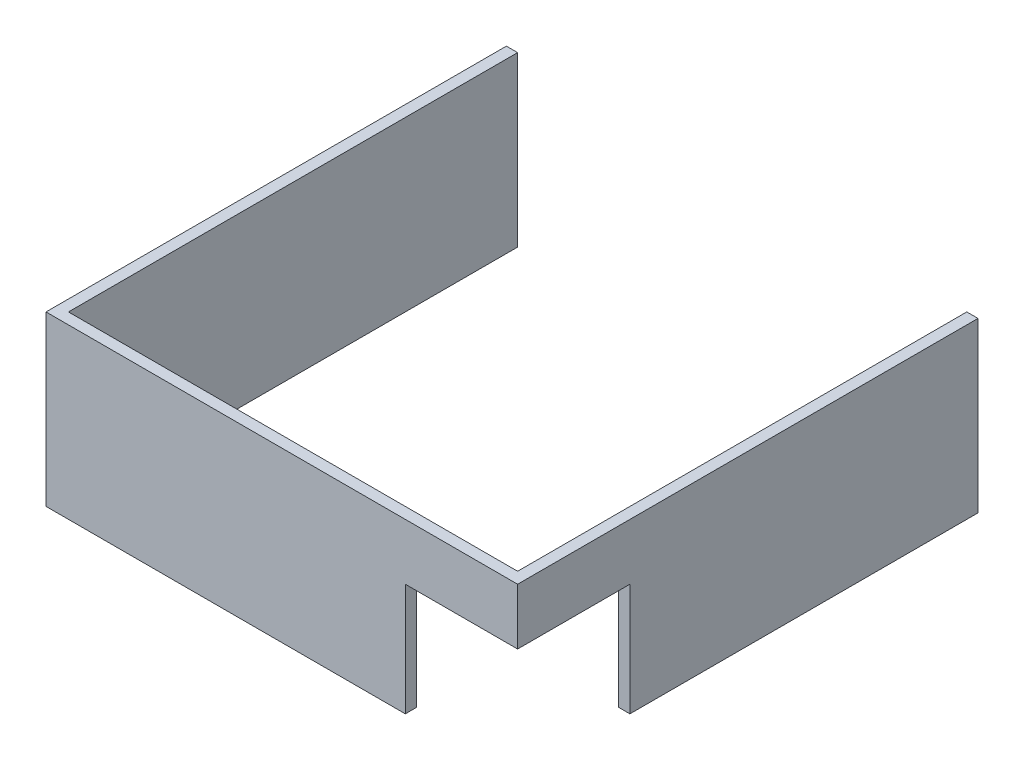
ISO-10303-21;
HEADER;
FILE_DESCRIPTION(('STEP AP214'),'2;1');
FILE_NAME('part.step','',(''),(''),'','','');
FILE_SCHEMA(('AUTOMOTIVE_DESIGN { 1 0 10303 214 1 1 1 1 }'));
ENDSEC;
DATA;
#1=APPLICATION_CONTEXT('core data for automotive mechanical design processes');
#2=APPLICATION_PROTOCOL_DEFINITION('international standard','automotive_design',2000,#1);
#3=PRODUCT_CONTEXT('',#1,'mechanical');
#4=PRODUCT('Part','Part','',(#3));
#5=PRODUCT_RELATED_PRODUCT_CATEGORY('part','',(#4));
#6=PRODUCT_DEFINITION_FORMATION('','',#4);
#7=PRODUCT_DEFINITION_CONTEXT('part definition',#1,'design');
#8=PRODUCT_DEFINITION('design','',#6,#7);
#9=PRODUCT_DEFINITION_SHAPE('','',#8);
#10=(LENGTH_UNIT() NAMED_UNIT(*) SI_UNIT(.MILLI.,.METRE.));
#11=(NAMED_UNIT(*) PLANE_ANGLE_UNIT() SI_UNIT($,.RADIAN.));
#12=(NAMED_UNIT(*) SI_UNIT($,.STERADIAN.) SOLID_ANGLE_UNIT());
#13=UNCERTAINTY_MEASURE_WITH_UNIT(LENGTH_MEASURE(1.E-05),#10,'distance_accuracy_value','');
#14=(GEOMETRIC_REPRESENTATION_CONTEXT(3) GLOBAL_UNCERTAINTY_ASSIGNED_CONTEXT((#13)) GLOBAL_UNIT_ASSIGNED_CONTEXT((#10,
#11,#12)) REPRESENTATION_CONTEXT('',''));
#15=CARTESIAN_POINT('',(0.,0.,0.));
#16=DIRECTION('',(0.,0.,1.));
#17=DIRECTION('',(1.,0.,0.));
#18=AXIS2_PLACEMENT_3D('',#15,#16,#17);
#19=CARTESIAN_POINT('',(0.,0.,0.));
#20=DIRECTION('',(0.,1.,0.));
#21=DIRECTION('',(0.,0.,1.));
#22=AXIS2_PLACEMENT_3D('',#19,#20,#21);
#23=PLANE('',#22);
#24=DIRECTION('',(0.,0.,-1.));
#25=VECTOR('',#24,1.);
#26=CARTESIAN_POINT('',(82.,0.,1.99999999999999));
#27=LINE('',#26,#25);
#28=CARTESIAN_POINT('',(82.,0.,-18.));
#29=VERTEX_POINT('',#28);
#30=CARTESIAN_POINT('',(82.,0.,-80.));
#31=VERTEX_POINT('',#30);
#32=EDGE_CURVE('E152',#29,#31,#27,.T.);
#33=ORIENTED_EDGE('',*,*,#32,.F.);
#34=DIRECTION('',(-1.,0.,0.));
#35=VECTOR('',#34,1.);
#36=CARTESIAN_POINT('',(0.,0.,-18.));
#37=LINE('',#36,#35);
#38=CARTESIAN_POINT('',(80.,0.,-18.));
#39=VERTEX_POINT('',#38);
#40=EDGE_CURVE('E41',#29,#39,#37,.T.);
#41=ORIENTED_EDGE('',*,*,#40,.T.);
#42=DIRECTION('',(0.,0.,1.));
#43=VECTOR('',#42,1.);
#44=CARTESIAN_POINT('',(80.,0.,0.));
#45=LINE('',#44,#43);
#46=CARTESIAN_POINT('',(80.,0.,-80.));
#47=VERTEX_POINT('',#46);
#48=EDGE_CURVE('E155',#47,#39,#45,.T.);
#49=ORIENTED_EDGE('',*,*,#48,.F.);
#50=DIRECTION('',(-1.,0.,0.));
#51=VECTOR('',#50,1.);
#52=CARTESIAN_POINT('',(82.,0.,-80.));
#53=LINE('',#52,#51);
#54=EDGE_CURVE('E124',#31,#47,#53,.T.);
#55=ORIENTED_EDGE('',*,*,#54,.F.);
#56=EDGE_LOOP('',(#33,#41,#49,#55));
#57=FACE_BOUND('',#56,.T.);
#58=ADVANCED_FACE('F33',(#57),#23,.F.);
#59=CARTESIAN_POINT('',(0.,30.,0.));
#60=DIRECTION('',(-1.,0.,0.));
#61=DIRECTION('',(0.,0.,1.));
#62=AXIS2_PLACEMENT_3D('',#59,#60,#61);
#63=PLANE('',#62);
#64=DIRECTION('',(0.,0.,-1.));
#65=VECTOR('',#64,1.);
#66=CARTESIAN_POINT('',(0.,0.,0.));
#67=LINE('',#66,#65);
#68=CARTESIAN_POINT('',(0.,0.,0.));
#69=VERTEX_POINT('',#68);
#70=CARTESIAN_POINT('',(0.,0.,-80.));
#71=VERTEX_POINT('',#70);
#72=EDGE_CURVE('E140',#69,#71,#67,.T.);
#73=ORIENTED_EDGE('',*,*,#72,.T.);
#74=DIRECTION('',(0.,-1.,0.));
#75=VECTOR('',#74,1.);
#76=CARTESIAN_POINT('',(0.,30.,-80.));
#77=LINE('',#76,#75);
#78=CARTESIAN_POINT('',(0.,30.,-80.));
#79=VERTEX_POINT('',#78);
#80=EDGE_CURVE('E171',#79,#71,#77,.T.);
#81=ORIENTED_EDGE('',*,*,#80,.F.);
#82=DIRECTION('',(0.,0.,-1.));
#83=VECTOR('',#82,1.);
#84=CARTESIAN_POINT('',(0.,30.,0.));
#85=LINE('',#84,#83);
#86=CARTESIAN_POINT('',(0.,30.,0.));
#87=VERTEX_POINT('',#86);
#88=EDGE_CURVE('E158',#87,#79,#85,.T.);
#89=ORIENTED_EDGE('',*,*,#88,.F.);
#90=DIRECTION('',(0.,-1.,0.));
#91=VECTOR('',#90,1.);
#92=CARTESIAN_POINT('',(0.,30.,0.));
#93=LINE('',#92,#91);
#94=EDGE_CURVE('E136',#87,#69,#93,.T.);
#95=ORIENTED_EDGE('',*,*,#94,.T.);
#96=EDGE_LOOP('',(#73,#81,#89,#95));
#97=FACE_BOUND('',#96,.T.);
#98=ADVANCED_FACE('F35',(#97),#63,.F.);
#99=CARTESIAN_POINT('',(0.,30.,-80.));
#100=DIRECTION('',(0.,0.,1.));
#101=DIRECTION('',(1.,0.,0.));
#102=AXIS2_PLACEMENT_3D('',#99,#100,#101);
#103=PLANE('',#102);
#104=DIRECTION('',(-1.,0.,0.));
#105=VECTOR('',#104,1.);
#106=CARTESIAN_POINT('',(0.,0.,-80.));
#107=LINE('',#106,#105);
#108=CARTESIAN_POINT('',(-2.,0.,-80.));
#109=VERTEX_POINT('',#108);
#110=EDGE_CURVE('E143',#71,#109,#107,.T.);
#111=ORIENTED_EDGE('',*,*,#110,.T.);
#112=DIRECTION('',(0.,-1.,0.));
#113=VECTOR('',#112,1.);
#114=CARTESIAN_POINT('',(-2.,30.,-80.));
#115=LINE('',#114,#113);
#116=CARTESIAN_POINT('',(-2.,30.,-80.));
#117=VERTEX_POINT('',#116);
#118=EDGE_CURVE('E168',#117,#109,#115,.T.);
#119=ORIENTED_EDGE('',*,*,#118,.F.);
#120=DIRECTION('',(-1.,0.,0.));
#121=VECTOR('',#120,1.);
#122=CARTESIAN_POINT('',(0.,30.,-80.));
#123=LINE('',#122,#121);
#124=EDGE_CURVE('E93',#79,#117,#123,.T.);
#125=ORIENTED_EDGE('',*,*,#124,.F.);
#126=ORIENTED_EDGE('',*,*,#80,.T.);
#127=EDGE_LOOP('',(#111,#119,#125,#126));
#128=FACE_BOUND('',#127,.T.);
#129=ADVANCED_FACE('F250',(#128),#103,.F.);
#130=CARTESIAN_POINT('',(-2.,30.,-80.));
#131=DIRECTION('',(1.,0.,0.));
#132=DIRECTION('',(0.,0.,-1.));
#133=AXIS2_PLACEMENT_3D('',#130,#131,#132);
#134=PLANE('',#133);
#135=DIRECTION('',(0.,0.,1.));
#136=VECTOR('',#135,1.);
#137=CARTESIAN_POINT('',(-2.,0.,-80.));
#138=LINE('',#137,#136);
#139=CARTESIAN_POINT('',(-2.,0.,2.));
#140=VERTEX_POINT('',#139);
#141=EDGE_CURVE('E146',#109,#140,#138,.T.);
#142=ORIENTED_EDGE('',*,*,#141,.T.);
#143=DIRECTION('',(0.,-1.,0.));
#144=VECTOR('',#143,1.);
#145=CARTESIAN_POINT('',(-2.,30.,2.));
#146=LINE('',#145,#144);
#147=CARTESIAN_POINT('',(-2.,30.,2.));
#148=VERTEX_POINT('',#147);
#149=EDGE_CURVE('E165',#148,#140,#146,.T.);
#150=ORIENTED_EDGE('',*,*,#149,.F.);
#151=DIRECTION('',(0.,0.,1.));
#152=VECTOR('',#151,1.);
#153=CARTESIAN_POINT('',(-2.,30.,-80.));
#154=LINE('',#153,#152);
#155=EDGE_CURVE('E197',#117,#148,#154,.T.);
#156=ORIENTED_EDGE('',*,*,#155,.F.);
#157=ORIENTED_EDGE('',*,*,#118,.T.);
#158=EDGE_LOOP('',(#142,#150,#156,#157));
#159=FACE_BOUND('',#158,.T.);
#160=ADVANCED_FACE('F249',(#159),#134,.F.);
#161=CARTESIAN_POINT('',(80.,30.,2.));
#162=DIRECTION('',(0.,0.,-1.));
#163=DIRECTION('',(-1.,0.,0.));
#164=AXIS2_PLACEMENT_3D('',#161,#162,#163);
#165=PLANE('',#164);
#166=DIRECTION('',(0.,-1.,0.));
#167=VECTOR('',#166,1.);
#168=CARTESIAN_POINT('',(62.,0.,1.99999999999999));
#169=LINE('',#168,#167);
#170=CARTESIAN_POINT('',(62.,20.,1.99999999999999));
#171=VERTEX_POINT('',#170);
#172=CARTESIAN_POINT('',(62.,0.,2.00000000000009));
#173=VERTEX_POINT('',#172);
#174=EDGE_CURVE('E48',#171,#173,#169,.T.);
#175=ORIENTED_EDGE('',*,*,#174,.F.);
#176=DIRECTION('',(1.,0.,0.));
#177=VECTOR('',#176,1.);
#178=CARTESIAN_POINT('',(62.,20.,1.99999999999999));
#179=LINE('',#178,#177);
#180=CARTESIAN_POINT('',(82.,20.,1.99999999999999));
#181=VERTEX_POINT('',#180);
#182=EDGE_CURVE('E191',#171,#181,#179,.T.);
#183=ORIENTED_EDGE('',*,*,#182,.T.);
#184=DIRECTION('',(0.,-1.,0.));
#185=VECTOR('',#184,1.);
#186=CARTESIAN_POINT('',(82.,30.,1.99999999999999));
#187=LINE('',#186,#185);
#188=CARTESIAN_POINT('',(82.,30.,1.99999999999999));
#189=VERTEX_POINT('',#188);
#190=EDGE_CURVE('E162',#189,#181,#187,.T.);
#191=ORIENTED_EDGE('',*,*,#190,.F.);
#192=DIRECTION('',(1.,0.,0.));
#193=VECTOR('',#192,1.);
#194=CARTESIAN_POINT('',(80.,30.,2.));
#195=LINE('',#194,#193);
#196=EDGE_CURVE('E199',#148,#189,#195,.T.);
#197=ORIENTED_EDGE('',*,*,#196,.F.);
#198=ORIENTED_EDGE('',*,*,#149,.T.);
#199=DIRECTION('',(1.,0.,0.));
#200=VECTOR('',#199,1.);
#201=CARTESIAN_POINT('',(80.,0.,2.));
#202=LINE('',#201,#200);
#203=EDGE_CURVE('E149',#140,#173,#202,.T.);
#204=ORIENTED_EDGE('',*,*,#203,.T.);
#205=EDGE_LOOP('',(#175,#183,#191,#197,#198,#204));
#206=FACE_BOUND('',#205,.T.);
#207=ADVANCED_FACE('F206',(#206),#165,.F.);
#208=CARTESIAN_POINT('',(82.,30.,1.99999999999999));
#209=DIRECTION('',(-1.,0.,0.));
#210=DIRECTION('',(0.,0.,1.));
#211=AXIS2_PLACEMENT_3D('',#208,#209,#210);
#212=PLANE('',#211);
#213=ORIENTED_EDGE('',*,*,#190,.T.);
#214=DIRECTION('',(0.,0.,1.));
#215=VECTOR('',#214,1.);
#216=CARTESIAN_POINT('',(82.,20.,1.99999999999999));
#217=LINE('',#216,#215);
#218=CARTESIAN_POINT('',(82.,20.,-18.));
#219=VERTEX_POINT('',#218);
#220=EDGE_CURVE('E215',#219,#181,#217,.T.);
#221=ORIENTED_EDGE('',*,*,#220,.F.);
#222=DIRECTION('',(0.,1.,0.));
#223=VECTOR('',#222,1.);
#224=CARTESIAN_POINT('',(82.,20.,-18.));
#225=LINE('',#224,#223);
#226=EDGE_CURVE('E212',#29,#219,#225,.T.);
#227=ORIENTED_EDGE('',*,*,#226,.F.);
#228=ORIENTED_EDGE('',*,*,#32,.T.);
#229=DIRECTION('',(0.,-1.,0.));
#230=VECTOR('',#229,1.);
#231=CARTESIAN_POINT('',(82.,30.,-80.));
#232=LINE('',#231,#230);
#233=CARTESIAN_POINT('',(82.,30.,-80.));
#234=VERTEX_POINT('',#233);
#235=EDGE_CURVE('E128',#234,#31,#232,.T.);
#236=ORIENTED_EDGE('',*,*,#235,.F.);
#237=DIRECTION('',(0.,0.,-1.));
#238=VECTOR('',#237,1.);
#239=CARTESIAN_POINT('',(82.,30.,1.99999999999999));
#240=LINE('',#239,#238);
#241=EDGE_CURVE('E115',#189,#234,#240,.T.);
#242=ORIENTED_EDGE('',*,*,#241,.F.);
#243=EDGE_LOOP('',(#213,#221,#227,#228,#236,#242));
#244=FACE_BOUND('',#243,.T.);
#245=ADVANCED_FACE('F211',(#244),#212,.F.);
#246=CARTESIAN_POINT('',(82.,30.,-80.));
#247=DIRECTION('',(0.,0.,1.));
#248=DIRECTION('',(1.,0.,0.));
#249=AXIS2_PLACEMENT_3D('',#246,#247,#248);
#250=PLANE('',#249);
#251=ORIENTED_EDGE('',*,*,#54,.T.);
#252=DIRECTION('',(0.,-1.,0.));
#253=VECTOR('',#252,1.);
#254=CARTESIAN_POINT('',(80.,30.,-80.));
#255=LINE('',#254,#253);
#256=CARTESIAN_POINT('',(80.,30.,-80.));
#257=VERTEX_POINT('',#256);
#258=EDGE_CURVE('E121',#257,#47,#255,.T.);
#259=ORIENTED_EDGE('',*,*,#258,.F.);
#260=DIRECTION('',(-1.,0.,0.));
#261=VECTOR('',#260,1.);
#262=CARTESIAN_POINT('',(82.,30.,-80.));
#263=LINE('',#262,#261);
#264=EDGE_CURVE('E108',#234,#257,#263,.T.);
#265=ORIENTED_EDGE('',*,*,#264,.F.);
#266=ORIENTED_EDGE('',*,*,#235,.T.);
#267=EDGE_LOOP('',(#251,#259,#265,#266));
#268=FACE_BOUND('',#267,.T.);
#269=ADVANCED_FACE('F122',(#268),#250,.F.);
#270=CARTESIAN_POINT('',(80.,30.,0.));
#271=DIRECTION('',(1.,0.,0.));
#272=DIRECTION('',(0.,0.,-1.));
#273=AXIS2_PLACEMENT_3D('',#270,#271,#272);
#274=PLANE('',#273);
#275=DIRECTION('',(0.,1.,0.));
#276=VECTOR('',#275,1.);
#277=CARTESIAN_POINT('',(80.,30.,-18.));
#278=LINE('',#277,#276);
#279=CARTESIAN_POINT('',(80.,20.,-18.));
#280=VERTEX_POINT('',#279);
#281=EDGE_CURVE('E185',#39,#280,#278,.T.);
#282=ORIENTED_EDGE('',*,*,#281,.T.);
#283=DIRECTION('',(0.,0.,1.));
#284=VECTOR('',#283,1.);
#285=CARTESIAN_POINT('',(80.,20.,0.));
#286=LINE('',#285,#284);
#287=CARTESIAN_POINT('',(80.,20.,0.));
#288=VERTEX_POINT('',#287);
#289=EDGE_CURVE('E144',#280,#288,#286,.T.);
#290=ORIENTED_EDGE('',*,*,#289,.T.);
#291=DIRECTION('',(0.,-1.,0.));
#292=VECTOR('',#291,1.);
#293=CARTESIAN_POINT('',(80.,30.,0.));
#294=LINE('',#293,#292);
#295=CARTESIAN_POINT('',(80.,30.,0.));
#296=VERTEX_POINT('',#295);
#297=EDGE_CURVE('E129',#296,#288,#294,.T.);
#298=ORIENTED_EDGE('',*,*,#297,.F.);
#299=DIRECTION('',(0.,0.,1.));
#300=VECTOR('',#299,1.);
#301=CARTESIAN_POINT('',(80.,30.,0.));
#302=LINE('',#301,#300);
#303=EDGE_CURVE('E112',#257,#296,#302,.T.);
#304=ORIENTED_EDGE('',*,*,#303,.F.);
#305=ORIENTED_EDGE('',*,*,#258,.T.);
#306=ORIENTED_EDGE('',*,*,#48,.T.);
#307=EDGE_LOOP('',(#282,#290,#298,#304,#305,#306));
#308=FACE_BOUND('',#307,.T.);
#309=ADVANCED_FACE('F132',(#308),#274,.F.);
#310=CARTESIAN_POINT('',(0.,30.,0.));
#311=DIRECTION('',(0.,0.,1.));
#312=DIRECTION('',(1.,0.,0.));
#313=AXIS2_PLACEMENT_3D('',#310,#311,#312);
#314=PLANE('',#313);
#315=ORIENTED_EDGE('',*,*,#297,.T.);
#316=DIRECTION('',(-1.,0.,0.));
#317=VECTOR('',#316,1.);
#318=CARTESIAN_POINT('',(0.,20.,0.));
#319=LINE('',#318,#317);
#320=CARTESIAN_POINT('',(62.,20.,0.));
#321=VERTEX_POINT('',#320);
#322=EDGE_CURVE('E11',#288,#321,#319,.T.);
#323=ORIENTED_EDGE('',*,*,#322,.T.);
#324=DIRECTION('',(0.,-1.,0.));
#325=VECTOR('',#324,1.);
#326=CARTESIAN_POINT('',(62.,30.,0.));
#327=LINE('',#326,#325);
#328=CARTESIAN_POINT('',(62.,0.,0.));
#329=VERTEX_POINT('',#328);
#330=EDGE_CURVE('E188',#321,#329,#327,.T.);
#331=ORIENTED_EDGE('',*,*,#330,.T.);
#332=DIRECTION('',(-1.,0.,0.));
#333=VECTOR('',#332,1.);
#334=CARTESIAN_POINT('',(0.,0.,0.));
#335=LINE('',#334,#333);
#336=EDGE_CURVE('E84',#329,#69,#335,.T.);
#337=ORIENTED_EDGE('',*,*,#336,.T.);
#338=ORIENTED_EDGE('',*,*,#94,.F.);
#339=DIRECTION('',(-1.,0.,0.));
#340=VECTOR('',#339,1.);
#341=CARTESIAN_POINT('',(0.,30.,0.));
#342=LINE('',#341,#340);
#343=EDGE_CURVE('E57',#296,#87,#342,.T.);
#344=ORIENTED_EDGE('',*,*,#343,.F.);
#345=EDGE_LOOP('',(#315,#323,#331,#337,#338,#344));
#346=FACE_BOUND('',#345,.T.);
#347=ADVANCED_FACE('F235',(#346),#314,.F.);
#348=CARTESIAN_POINT('',(0.,30.,0.));
#349=DIRECTION('',(0.,1.,0.));
#350=DIRECTION('',(0.,0.,1.));
#351=AXIS2_PLACEMENT_3D('',#348,#349,#350);
#352=PLANE('',#351);
#353=ORIENTED_EDGE('',*,*,#88,.T.);
#354=ORIENTED_EDGE('',*,*,#124,.T.);
#355=ORIENTED_EDGE('',*,*,#155,.T.);
#356=ORIENTED_EDGE('',*,*,#196,.T.);
#357=ORIENTED_EDGE('',*,*,#241,.T.);
#358=ORIENTED_EDGE('',*,*,#264,.T.);
#359=ORIENTED_EDGE('',*,*,#303,.T.);
#360=ORIENTED_EDGE('',*,*,#343,.T.);
#361=EDGE_LOOP('',(#353,#354,#355,#356,#357,#358,#359,#360));
#362=FACE_BOUND('',#361,.T.);
#363=ADVANCED_FACE('F110',(#362),#352,.T.);
#364=ORIENTED_EDGE('',*,*,#336,.F.);
#365=DIRECTION('',(0.,0.,-1.));
#366=VECTOR('',#365,1.);
#367=CARTESIAN_POINT('',(62.,0.,1.99999999999999));
#368=LINE('',#367,#366);
#369=EDGE_CURVE('E226',#173,#329,#368,.T.);
#370=ORIENTED_EDGE('',*,*,#369,.F.);
#371=ORIENTED_EDGE('',*,*,#203,.F.);
#372=ORIENTED_EDGE('',*,*,#141,.F.);
#373=ORIENTED_EDGE('',*,*,#110,.F.);
#374=ORIENTED_EDGE('',*,*,#72,.F.);
#375=EDGE_LOOP('',(#364,#370,#371,#372,#373,#374));
#376=FACE_BOUND('',#375,.T.);
#377=ADVANCED_FACE('F238',(#376),#23,.F.);
#378=CARTESIAN_POINT('',(62.,20.,1.99999999999999));
#379=DIRECTION('',(0.,1.,0.));
#380=DIRECTION('',(0.,0.,1.));
#381=AXIS2_PLACEMENT_3D('',#378,#379,#380);
#382=PLANE('',#381);
#383=DIRECTION('',(1.,0.,0.));
#384=VECTOR('',#383,1.);
#385=CARTESIAN_POINT('',(62.,20.,-18.));
#386=LINE('',#385,#384);
#387=EDGE_CURVE('E223',#280,#219,#386,.T.);
#388=ORIENTED_EDGE('',*,*,#387,.T.);
#389=ORIENTED_EDGE('',*,*,#220,.T.);
#390=ORIENTED_EDGE('',*,*,#182,.F.);
#391=DIRECTION('',(0.,0.,1.));
#392=VECTOR('',#391,1.);
#393=CARTESIAN_POINT('',(62.,20.,1.99999999999999));
#394=LINE('',#393,#392);
#395=EDGE_CURVE('E220',#321,#171,#394,.T.);
#396=ORIENTED_EDGE('',*,*,#395,.F.);
#397=ORIENTED_EDGE('',*,*,#322,.F.);
#398=ORIENTED_EDGE('',*,*,#289,.F.);
#399=EDGE_LOOP('',(#388,#389,#390,#396,#397,#398));
#400=FACE_BOUND('',#399,.T.);
#401=ADVANCED_FACE('F243',(#400),#382,.F.);
#402=CARTESIAN_POINT('',(62.,20.,-18.));
#403=DIRECTION('',(0.,0.,-1.));
#404=DIRECTION('',(-1.,0.,0.));
#405=AXIS2_PLACEMENT_3D('',#402,#403,#404);
#406=PLANE('',#405);
#407=ORIENTED_EDGE('',*,*,#40,.F.);
#408=ORIENTED_EDGE('',*,*,#226,.T.);
#409=ORIENTED_EDGE('',*,*,#387,.F.);
#410=ORIENTED_EDGE('',*,*,#281,.F.);
#411=EDGE_LOOP('',(#407,#408,#409,#410));
#412=FACE_BOUND('',#411,.T.);
#413=ADVANCED_FACE('F268',(#412),#406,.F.);
#414=CARTESIAN_POINT('',(62.,0.,0.));
#415=DIRECTION('',(-1.,0.,0.));
#416=DIRECTION('',(0.,0.,1.));
#417=AXIS2_PLACEMENT_3D('',#414,#415,#416);
#418=PLANE('',#417);
#419=ORIENTED_EDGE('',*,*,#395,.T.);
#420=ORIENTED_EDGE('',*,*,#174,.T.);
#421=ORIENTED_EDGE('',*,*,#369,.T.);
#422=ORIENTED_EDGE('',*,*,#330,.F.);
#423=EDGE_LOOP('',(#419,#420,#421,#422));
#424=FACE_BOUND('',#423,.T.);
#425=ADVANCED_FACE('F231',(#424),#418,.F.);
#426=CLOSED_SHELL('',(#58,#98,#129,#160,#207,#245,#269,#309,#347,#363,#377,#401,#413,#425));
#427=MANIFOLD_SOLID_BREP('B2',#426);
#428=ADVANCED_BREP_SHAPE_REPRESENTATION('',(#18,#427),#14);
#429=SHAPE_DEFINITION_REPRESENTATION(#9,#428);
ENDSEC;
END-ISO-10303-21;
